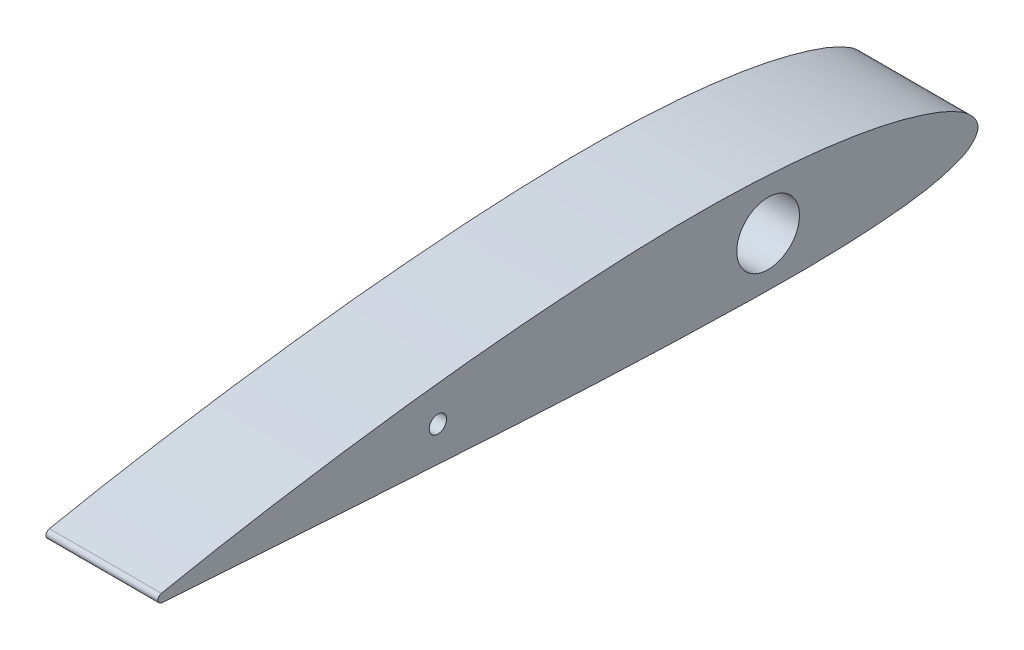
ISO-10303-21;
HEADER;
FILE_DESCRIPTION(('STEP AP214'),'2;1');
FILE_NAME('part.step','',(''),(''),'','','');
FILE_SCHEMA(('AUTOMOTIVE_DESIGN { 1 0 10303 214 1 1 1 1 }'));
ENDSEC;
DATA;
#1=APPLICATION_CONTEXT('core data for automotive mechanical design processes');
#2=APPLICATION_PROTOCOL_DEFINITION('international standard','automotive_design',2000,#1);
#3=PRODUCT_CONTEXT('',#1,'mechanical');
#4=PRODUCT('Part','Part','',(#3));
#5=PRODUCT_RELATED_PRODUCT_CATEGORY('part','',(#4));
#6=PRODUCT_DEFINITION_FORMATION('','',#4);
#7=PRODUCT_DEFINITION_CONTEXT('part definition',#1,'design');
#8=PRODUCT_DEFINITION('design','',#6,#7);
#9=PRODUCT_DEFINITION_SHAPE('','',#8);
#10=(LENGTH_UNIT() NAMED_UNIT(*) SI_UNIT(.MILLI.,.METRE.));
#11=(NAMED_UNIT(*) PLANE_ANGLE_UNIT() SI_UNIT($,.RADIAN.));
#12=(NAMED_UNIT(*) SI_UNIT($,.STERADIAN.) SOLID_ANGLE_UNIT());
#13=UNCERTAINTY_MEASURE_WITH_UNIT(LENGTH_MEASURE(1.E-05),#10,'distance_accuracy_value','');
#14=(GEOMETRIC_REPRESENTATION_CONTEXT(3) GLOBAL_UNCERTAINTY_ASSIGNED_CONTEXT((#13)) GLOBAL_UNIT_ASSIGNED_CONTEXT((#10,
#11,#12)) REPRESENTATION_CONTEXT('',''));
#15=CARTESIAN_POINT('',(0.,0.,0.));
#16=DIRECTION('',(0.,0.,1.));
#17=DIRECTION('',(1.,0.,0.));
#18=AXIS2_PLACEMENT_3D('',#15,#16,#17);
#19=CARTESIAN_POINT('',(4.99999791729156,1.90292450227578,0.25466103449607));
#20=DIRECTION('',(1.,0.,0.));
#21=DIRECTION('',(0.,0.,-1.));
#22=AXIS2_PLACEMENT_3D('',#19,#20,#21);
#23=PLANE('',#22);
#24=CARTESIAN_POINT('',(4.99999791729167,0.540547200900129,291.608124066476));
#25=DIRECTION('',(1.,0.,0.));
#26=DIRECTION('',(0.,0.,-1.));
#27=AXIS2_PLACEMENT_3D('',#24,#25,#26);
#28=CIRCLE('',#27,1.53040700432955);
#29=CARTESIAN_POINT('',(4.99999791729167,2.0405472135274,291.911678939636));
#30=VERTEX_POINT('',#29);
#31=CARTESIAN_POINT('',(4.99999791729167,-0.959452786472597,291.91167906443));
#32=VERTEX_POINT('',#31);
#33=EDGE_CURVE('E78',#30,#32,#28,.T.);
#34=ORIENTED_EDGE('',*,*,#33,.F.);
#35=CARTESIAN_POINT('',(4.99999791729167,-0.39,300.));
#36=CARTESIAN_POINT('',(4.99999791729167,-0.742836743253515,295.000195156336));
#37=CARTESIAN_POINT('',(4.99999791729167,-1.44846177238731,285.001272124847));
#38=CARTESIAN_POINT('',(4.99999791729167,-2.79159322236986,264.99942976966));
#39=CARTESIAN_POINT('',(4.99999791729167,-4.53293845373569,240.004833434409));
#40=CARTESIAN_POINT('',(4.99999791729167,-6.42365888731104,210.001446042239));
#41=CARTESIAN_POINT('',(4.99999791729167,-8.29156110822139,180.003187834693));
#42=CARTESIAN_POINT('',(4.99999791729167,-10.0886232457484,150.010016746674));
#43=CARTESIAN_POINT('',(4.99999791729167,-11.4712429667628,120.008146035044));
#44=CARTESIAN_POINT('',(4.99999791729167,-12.2657136301891,95.0034955151066));
#45=CARTESIAN_POINT('',(4.99999791729167,-12.7072230244223,75.0016422968432));
#46=CARTESIAN_POINT('',(4.99999791729167,-12.7548777124537,59.998233621459));
#47=CARTESIAN_POINT('',(4.99999791729167,-12.4129075723238,44.9841093615568));
#48=CARTESIAN_POINT('',(4.99999791729167,-11.559964157689,32.4800733956672));
#49=CARTESIAN_POINT('',(4.99999791729167,-10.4517950472858,22.4627624735692));
#50=CARTESIAN_POINT('',(4.99999791729167,-9.15324348591141,14.9234033884621));
#51=CARTESIAN_POINT('',(4.99999791729167,-7.34216026564509,8.54279177539215));
#52=CARTESIAN_POINT('',(4.99999791729167,-4.95792019834951,3.11801617910718));
#53=CARTESIAN_POINT('',(4.99999791729167,0.269631353627181,-1.8894686888088));
#54=CARTESIAN_POINT('',(4.99999791729167,6.21691110780033,2.93129098713537));
#55=CARTESIAN_POINT('',(4.99999791729167,9.6559208215277,8.45946996980209));
#56=CARTESIAN_POINT('',(4.99999791729167,12.4924762739347,14.8682769749789));
#57=CARTESIAN_POINT('',(4.99999791729167,14.9269739564043,22.432539711509));
#58=CARTESIAN_POINT('',(4.99999791729167,17.6047534606942,32.4099192056446));
#59=CARTESIAN_POINT('',(4.99999791729167,19.971634170319,44.9251398339456));
#60=CARTESIAN_POINT('',(4.99999791729167,21.8937043176524,59.9629782354658));
#61=CARTESIAN_POINT('',(4.99999791729167,23.1074657207241,74.9818554735973));
#62=CARTESIAN_POINT('',(4.99999791729167,23.9358084070472,94.9906645572763));
#63=CARTESIAN_POINT('',(4.99999791729167,23.6350972087115,120.026341517704));
#64=CARTESIAN_POINT('',(4.99999791729167,21.8585805133857,150.033255352331));
#65=CARTESIAN_POINT('',(4.99999791729167,19.235240906112,180.04700434413));
#66=CARTESIAN_POINT('',(4.99999791729167,15.6524957785844,210.047746847612));
#67=CARTESIAN_POINT('',(4.99999791729167,11.3564479704569,240.053439046775));
#68=CARTESIAN_POINT('',(4.99999791729167,7.20557933364544,265.041645707904));
#69=CARTESIAN_POINT('',(4.99999791729167,3.4593107902557,285.021444416311));
#70=CARTESIAN_POINT('',(4.99999791729167,1.41400008195562,295.002773197824));
#71=CARTESIAN_POINT('',(4.99999791729167,0.39,300.));
#72=B_SPLINE_CURVE_WITH_KNOTS('',3,(#35,#36,#37,#38,#39,#40,#41,#42,#43,#44,#45,#46,#47,#48,#49,
#50,#51,#52,#53,#54,#55,#56,#57,#58,#59,#60,#61,#62,#63,#64,#65,#66,#67,#68,#69,#70,#71),
.UNSPECIFIED.,.F.,.F.,(4,1,1,1,1,1,1,1,1,1,1,1,1,1,1,1,1,1,1,1,1,1,1,1,1,1,1,1,1,1,1,1,1,1,4),
(0.,0.0245772830107216,0.0491511906627295,0.0982990059667456,0.147433904270463,
0.196562636444968,0.245679621469968,0.294766050749481,0.343825728140348,0.368347920163234,
0.392865258253086,0.417390832752106,0.441968115762827,0.454308960852197,0.466764612384847,
0.479549009299713,0.486390870596113,0.496541146705335,0.508735879677104,0.516120591330171,
0.52959359456451,0.542510181084779,0.555201424983405,0.58018520417604,0.604908796345071,
0.629508374430089,0.654047278206467,0.703083425398507,0.752194829543168,0.801418903384035,
0.850793680090034,0.900327075073031,0.950040713835742,0.974987510250135,1.),.UNSPECIFIED.);
#73=EDGE_CURVE('E73',#32,#30,#72,.T.);
#74=ORIENTED_EDGE('',*,*,#73,.F.);
#75=EDGE_LOOP('',(#34,#74));
#76=FACE_BOUND('',#75,.T.);
#77=CARTESIAN_POINT('',(4.99999791729156,5.0153983136222,193.048498388895));
#78=DIRECTION('',(-1.,0.,0.));
#79=DIRECTION('',(0.,0.,1.));
#80=AXIS2_PLACEMENT_3D('',#77,#78,#79);
#81=CIRCLE('',#80,3.09999999999999);
#82=CARTESIAN_POINT('',(4.99999791729156,5.0153983136222,196.148498388895));
#83=VERTEX_POINT('',#82);
#84=EDGE_CURVE('E108',#83,#83,#81,.T.);
#85=ORIENTED_EDGE('',*,*,#84,.F.);
#86=EDGE_LOOP('',(#85));
#87=FACE_BOUND('',#86,.T.);
#88=CARTESIAN_POINT('',(4.99999791729156,5.00598230708316,75.));
#89=DIRECTION('',(-1.,0.,0.));
#90=DIRECTION('',(0.,0.,1.));
#91=AXIS2_PLACEMENT_3D('',#88,#89,#90);
#92=CIRCLE('',#91,11.2);
#93=CARTESIAN_POINT('',(4.99999791729156,5.00598230708316,86.2));
#94=VERTEX_POINT('',#93);
#95=EDGE_CURVE('E105',#94,#94,#92,.T.);
#96=ORIENTED_EDGE('',*,*,#95,.F.);
#97=EDGE_LOOP('',(#96));
#98=FACE_BOUND('',#97,.T.);
#99=ADVANCED_FACE('F50',(#76,#87,#98),#23,.F.);
#100=CARTESIAN_POINT('',(4.99999791729156,5.0153983136222,193.048498388895));
#101=DIRECTION('',(1.,0.,0.));
#102=DIRECTION('',(0.,0.,-1.));
#103=AXIS2_PLACEMENT_3D('',#100,#101,#102);
#104=CYLINDRICAL_SURFACE('',#103,3.09999999999999);
#105=ORIENTED_EDGE('',*,*,#84,.T.);
#106=EDGE_LOOP('',(#105));
#107=FACE_BOUND('',#106,.T.);
#108=CARTESIAN_POINT('',(44.9999979172916,5.0153983136222,193.048498388895));
#109=DIRECTION('',(-1.,0.,0.));
#110=DIRECTION('',(0.,0.,1.));
#111=AXIS2_PLACEMENT_3D('',#108,#109,#110);
#112=CIRCLE('',#111,3.09999999999999);
#113=CARTESIAN_POINT('',(44.9999979172916,5.0153983136222,196.148498388895));
#114=VERTEX_POINT('',#113);
#115=EDGE_CURVE('E102',#114,#114,#112,.T.);
#116=ORIENTED_EDGE('',*,*,#115,.F.);
#117=EDGE_LOOP('',(#116));
#118=FACE_BOUND('',#117,.T.);
#119=ADVANCED_FACE('F121',(#107,#118),#104,.F.);
#120=CARTESIAN_POINT('',(1500.,0.540547200900129,291.608124066476));
#121=DIRECTION('',(-1.,0.,0.));
#122=DIRECTION('',(0.,0.,1.));
#123=AXIS2_PLACEMENT_3D('',#120,#121,#122);
#124=CYLINDRICAL_SURFACE('',#123,1.53040700432955);
#125=DIRECTION('',(-1.,0.,0.));
#126=VECTOR('',#125,1.);
#127=CARTESIAN_POINT('',(1500.,-0.959452786472597,291.91167906443));
#128=LINE('',#127,#126);
#129=CARTESIAN_POINT('',(44.9999979172915,-0.959452786472597,291.91167906443));
#130=VERTEX_POINT('',#129);
#131=EDGE_CURVE('E60',#130,#32,#128,.T.);
#132=ORIENTED_EDGE('',*,*,#131,.F.);
#133=CARTESIAN_POINT('',(44.9999979172915,0.540547200900129,291.608124066476));
#134=DIRECTION('',(-1.,0.,0.));
#135=DIRECTION('',(0.,0.,1.));
#136=AXIS2_PLACEMENT_3D('',#133,#134,#135);
#137=CIRCLE('',#136,1.53040700432955);
#138=CARTESIAN_POINT('',(44.9999979172915,2.0405472135274,291.911678939636));
#139=VERTEX_POINT('',#138);
#140=EDGE_CURVE('E86',#130,#139,#137,.T.);
#141=ORIENTED_EDGE('',*,*,#140,.T.);
#142=DIRECTION('',(-1.,0.,0.));
#143=VECTOR('',#142,1.);
#144=CARTESIAN_POINT('',(1500.,2.0405472135274,291.911678939636));
#145=LINE('',#144,#143);
#146=EDGE_CURVE('E12',#139,#30,#145,.T.);
#147=ORIENTED_EDGE('',*,*,#146,.T.);
#148=ORIENTED_EDGE('',*,*,#33,.T.);
#149=EDGE_LOOP('',(#132,#141,#147,#148));
#150=FACE_BOUND('',#149,.T.);
#151=ADVANCED_FACE('F88',(#150),#124,.T.);
#152=CARTESIAN_POINT('',(1500.,-0.39,300.));
#153=CARTESIAN_POINT('',(1500.,-0.742836743253515,295.000195156336));
#154=CARTESIAN_POINT('',(1500.,-1.44846177238731,285.001272124847));
#155=CARTESIAN_POINT('',(1500.,-2.79159322236986,264.99942976966));
#156=CARTESIAN_POINT('',(1500.,-4.53293845373569,240.004833434409));
#157=CARTESIAN_POINT('',(1500.,-6.42365888731104,210.001446042239));
#158=CARTESIAN_POINT('',(1500.,-8.29156110822139,180.003187834693));
#159=CARTESIAN_POINT('',(1500.,-10.0886232457484,150.010016746674));
#160=CARTESIAN_POINT('',(1500.,-11.4712429667628,120.008146035044));
#161=CARTESIAN_POINT('',(1500.,-12.2657136301891,95.0034955151066));
#162=CARTESIAN_POINT('',(1500.,-12.7072230244223,75.0016422968432));
#163=CARTESIAN_POINT('',(1500.,-12.7548777124537,59.998233621459));
#164=CARTESIAN_POINT('',(1500.,-12.4129075723238,44.9841093615568));
#165=CARTESIAN_POINT('',(1500.,-11.559964157689,32.4800733956672));
#166=CARTESIAN_POINT('',(1500.,-10.4517950472858,22.4627624735692));
#167=CARTESIAN_POINT('',(1500.,-9.15324348591141,14.9234033884621));
#168=CARTESIAN_POINT('',(1500.,-7.34216026564509,8.54279177539215));
#169=CARTESIAN_POINT('',(1500.,-4.95792019834951,3.11801617910718));
#170=CARTESIAN_POINT('',(1500.,0.269631353627181,-1.8894686888088));
#171=CARTESIAN_POINT('',(1500.,6.21691110780033,2.93129098713537));
#172=CARTESIAN_POINT('',(1500.,9.6559208215277,8.45946996980209));
#173=CARTESIAN_POINT('',(1500.,12.4924762739347,14.8682769749789));
#174=CARTESIAN_POINT('',(1500.,14.9269739564043,22.432539711509));
#175=CARTESIAN_POINT('',(1500.,17.6047534606942,32.4099192056446));
#176=CARTESIAN_POINT('',(1500.,19.971634170319,44.9251398339456));
#177=CARTESIAN_POINT('',(1500.,21.8937043176524,59.9629782354658));
#178=CARTESIAN_POINT('',(1500.,23.1074657207241,74.9818554735973));
#179=CARTESIAN_POINT('',(1500.,23.9358084070472,94.9906645572763));
#180=CARTESIAN_POINT('',(1500.,23.6350972087115,120.026341517704));
#181=CARTESIAN_POINT('',(1500.,21.8585805133857,150.033255352331));
#182=CARTESIAN_POINT('',(1500.,19.235240906112,180.04700434413));
#183=CARTESIAN_POINT('',(1500.,15.6524957785844,210.047746847612));
#184=CARTESIAN_POINT('',(1500.,11.3564479704569,240.053439046775));
#185=CARTESIAN_POINT('',(1500.,7.20557933364544,265.041645707904));
#186=CARTESIAN_POINT('',(1500.,3.4593107902557,285.021444416311));
#187=CARTESIAN_POINT('',(1500.,1.41400008195562,295.002773197824));
#188=CARTESIAN_POINT('',(1500.,0.39,300.));
#189=B_SPLINE_CURVE_WITH_KNOTS('',3,(#152,#153,#154,#155,#156,#157,#158,#159,#160,#161,#162,
#163,#164,#165,#166,#167,#168,#169,#170,#171,#172,#173,#174,#175,#176,#177,#178,#179,#180,#181,
#182,#183,#184,#185,#186,#187,#188),.UNSPECIFIED.,.F.,.F.,(4,1,1,1,1,1,1,1,1,1,1,1,1,1,1,1,1,1,
1,1,1,1,1,1,1,1,1,1,1,1,1,1,1,1,4),(0.,0.0245772830107216,0.0491511906627295,0.0982990059667456,
0.147433904270463,0.196562636444968,0.245679621469968,0.294766050749481,0.343825728140348,
0.368347920163234,0.392865258253086,0.417390832752106,0.441968115762827,0.454308960852197,
0.466764612384847,0.479549009299713,0.486390870596113,0.496541146705335,0.508735879677104,
0.516120591330171,0.52959359456451,0.542510181084779,0.555201424983405,0.58018520417604,
0.604908796345071,0.629508374430089,0.654047278206467,0.703083425398507,0.752194829543168,
0.801418903384035,0.850793680090034,0.900327075073031,0.950040713835742,0.974987510250135,1.),.UNSPECIFIED.);
#190=DIRECTION('',(-1.,0.,0.));
#191=VECTOR('',#190,1.);
#192=SURFACE_OF_LINEAR_EXTRUSION('',#189,#191);
#193=ORIENTED_EDGE('',*,*,#146,.F.);
#194=CARTESIAN_POINT('',(44.9999979172915,-0.39,300.));
#195=CARTESIAN_POINT('',(44.9999979172915,-0.742836743253515,295.000195156336));
#196=CARTESIAN_POINT('',(44.9999979172915,-1.44846177238731,285.001272124847));
#197=CARTESIAN_POINT('',(44.9999979172915,-2.79159322236986,264.99942976966));
#198=CARTESIAN_POINT('',(44.9999979172915,-4.53293845373569,240.004833434409));
#199=CARTESIAN_POINT('',(44.9999979172915,-6.42365888731104,210.001446042239));
#200=CARTESIAN_POINT('',(44.9999979172915,-8.29156110822139,180.003187834693));
#201=CARTESIAN_POINT('',(44.9999979172915,-10.0886232457484,150.010016746674));
#202=CARTESIAN_POINT('',(44.9999979172915,-11.4712429667628,120.008146035044));
#203=CARTESIAN_POINT('',(44.9999979172915,-12.2657136301891,95.0034955151066));
#204=CARTESIAN_POINT('',(44.9999979172915,-12.7072230244223,75.0016422968432));
#205=CARTESIAN_POINT('',(44.9999979172915,-12.7548777124537,59.998233621459));
#206=CARTESIAN_POINT('',(44.9999979172915,-12.4129075723238,44.9841093615568));
#207=CARTESIAN_POINT('',(44.9999979172915,-11.559964157689,32.4800733956672));
#208=CARTESIAN_POINT('',(44.9999979172915,-10.4517950472858,22.4627624735692));
#209=CARTESIAN_POINT('',(44.9999979172915,-9.15324348591141,14.9234033884621));
#210=CARTESIAN_POINT('',(44.9999979172915,-7.34216026564509,8.54279177539215));
#211=CARTESIAN_POINT('',(44.9999979172915,-4.95792019834951,3.11801617910718));
#212=CARTESIAN_POINT('',(44.9999979172915,0.269631353627181,-1.8894686888088));
#213=CARTESIAN_POINT('',(44.9999979172915,6.21691110780033,2.93129098713537));
#214=CARTESIAN_POINT('',(44.9999979172915,9.6559208215277,8.45946996980209));
#215=CARTESIAN_POINT('',(44.9999979172915,12.4924762739347,14.8682769749789));
#216=CARTESIAN_POINT('',(44.9999979172915,14.9269739564043,22.432539711509));
#217=CARTESIAN_POINT('',(44.9999979172915,17.6047534606942,32.4099192056446));
#218=CARTESIAN_POINT('',(44.9999979172915,19.971634170319,44.9251398339456));
#219=CARTESIAN_POINT('',(44.9999979172915,21.8937043176524,59.9629782354658));
#220=CARTESIAN_POINT('',(44.9999979172915,23.1074657207241,74.9818554735973));
#221=CARTESIAN_POINT('',(44.9999979172915,23.9358084070472,94.9906645572763));
#222=CARTESIAN_POINT('',(44.9999979172915,23.6350972087115,120.026341517704));
#223=CARTESIAN_POINT('',(44.9999979172915,21.8585805133857,150.033255352331));
#224=CARTESIAN_POINT('',(44.9999979172915,19.235240906112,180.04700434413));
#225=CARTESIAN_POINT('',(44.9999979172915,15.6524957785844,210.047746847612));
#226=CARTESIAN_POINT('',(44.9999979172915,11.3564479704569,240.053439046775));
#227=CARTESIAN_POINT('',(44.9999979172915,7.20557933364544,265.041645707904));
#228=CARTESIAN_POINT('',(44.9999979172915,3.4593107902557,285.021444416311));
#229=CARTESIAN_POINT('',(44.9999979172915,1.41400008195562,295.002773197824));
#230=CARTESIAN_POINT('',(44.9999979172915,0.39,300.));
#231=B_SPLINE_CURVE_WITH_KNOTS('',3,(#194,#195,#196,#197,#198,#199,#200,#201,#202,#203,#204,
#205,#206,#207,#208,#209,#210,#211,#212,#213,#214,#215,#216,#217,#218,#219,#220,#221,#222,#223,
#224,#225,#226,#227,#228,#229,#230),.UNSPECIFIED.,.F.,.F.,(4,1,1,1,1,1,1,1,1,1,1,1,1,1,1,1,1,1,
1,1,1,1,1,1,1,1,1,1,1,1,1,1,1,1,4),(0.,0.0245772830107216,0.0491511906627295,0.0982990059667456,
0.147433904270463,0.196562636444968,0.245679621469968,0.294766050749481,0.343825728140348,
0.368347920163234,0.392865258253086,0.417390832752106,0.441968115762827,0.454308960852197,
0.466764612384847,0.479549009299713,0.486390870596113,0.496541146705335,0.508735879677104,
0.516120591330171,0.52959359456451,0.542510181084779,0.555201424983405,0.58018520417604,
0.604908796345071,0.629508374430089,0.654047278206467,0.703083425398507,0.752194829543168,
0.801418903384035,0.850793680090034,0.900327075073031,0.950040713835742,0.974987510250135,1.),.UNSPECIFIED.);
#232=EDGE_CURVE('E66',#139,#130,#231,.F.);
#233=ORIENTED_EDGE('',*,*,#232,.T.);
#234=ORIENTED_EDGE('',*,*,#131,.T.);
#235=ORIENTED_EDGE('',*,*,#73,.T.);
#236=EDGE_LOOP('',(#193,#233,#234,#235));
#237=FACE_BOUND('',#236,.T.);
#238=ADVANCED_FACE('F52',(#237),#192,.F.);
#239=CARTESIAN_POINT('',(4.99999791729156,5.00598230708316,75.));
#240=DIRECTION('',(1.,0.,0.));
#241=DIRECTION('',(0.,0.,-1.));
#242=AXIS2_PLACEMENT_3D('',#239,#240,#241);
#243=CYLINDRICAL_SURFACE('',#242,11.2);
#244=ORIENTED_EDGE('',*,*,#95,.T.);
#245=EDGE_LOOP('',(#244));
#246=FACE_BOUND('',#245,.T.);
#247=CARTESIAN_POINT('',(44.9999979172916,5.00598230708316,75.));
#248=DIRECTION('',(-1.,0.,0.));
#249=DIRECTION('',(0.,0.,1.));
#250=AXIS2_PLACEMENT_3D('',#247,#248,#249);
#251=CIRCLE('',#250,11.2);
#252=CARTESIAN_POINT('',(44.9999979172916,5.00598230708316,86.2));
#253=VERTEX_POINT('',#252);
#254=EDGE_CURVE('E90',#253,#253,#251,.T.);
#255=ORIENTED_EDGE('',*,*,#254,.F.);
#256=EDGE_LOOP('',(#255));
#257=FACE_BOUND('',#256,.T.);
#258=ADVANCED_FACE('F128',(#246,#257),#243,.F.);
#259=CARTESIAN_POINT('',(44.9999979172916,1.90292450227578,0.25466103449607));
#260=DIRECTION('',(1.,0.,0.));
#261=DIRECTION('',(0.,0.,-1.));
#262=AXIS2_PLACEMENT_3D('',#259,#260,#261);
#263=PLANE('',#262);
#264=ORIENTED_EDGE('',*,*,#254,.T.);
#265=EDGE_LOOP('',(#264));
#266=FACE_BOUND('',#265,.T.);
#267=ORIENTED_EDGE('',*,*,#115,.T.);
#268=EDGE_LOOP('',(#267));
#269=FACE_BOUND('',#268,.T.);
#270=ORIENTED_EDGE('',*,*,#140,.F.);
#271=ORIENTED_EDGE('',*,*,#232,.F.);
#272=EDGE_LOOP('',(#270,#271));
#273=FACE_BOUND('',#272,.T.);
#274=ADVANCED_FACE('F131',(#266,#269,#273),#263,.T.);
#275=CLOSED_SHELL('',(#99,#119,#151,#238,#258,#274));
#276=MANIFOLD_SOLID_BREP('B2',#275);
#277=ADVANCED_BREP_SHAPE_REPRESENTATION('',(#18,#276),#14);
#278=SHAPE_DEFINITION_REPRESENTATION(#9,#277);
ENDSEC;
END-ISO-10303-21;
